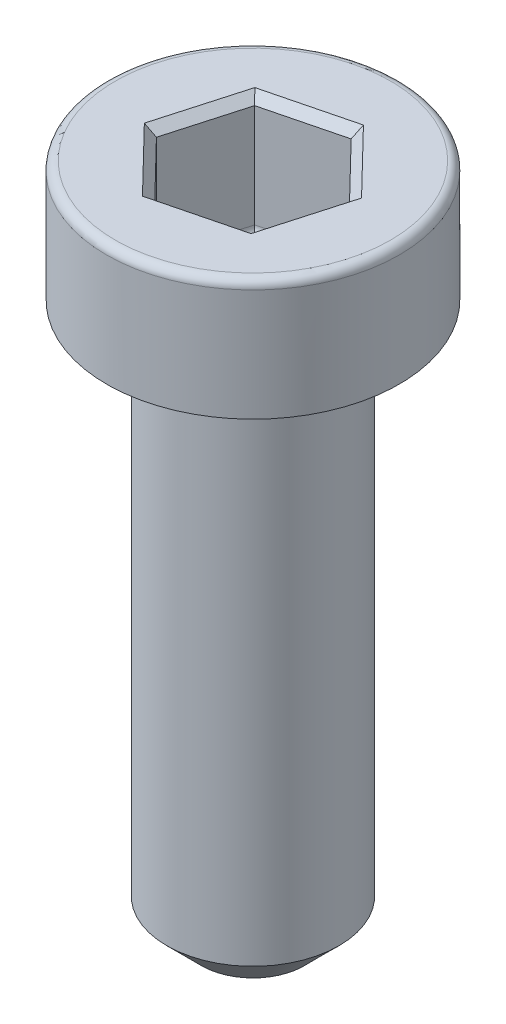
ISO-10303-21;
HEADER;
FILE_DESCRIPTION(('STEP AP214'),'2;1');
FILE_NAME('part.step','',(''),(''),'','','');
FILE_SCHEMA(('AUTOMOTIVE_DESIGN { 1 0 10303 214 1 1 1 1 }'));
ENDSEC;
DATA;
#1=APPLICATION_CONTEXT('core data for automotive mechanical design processes');
#2=APPLICATION_PROTOCOL_DEFINITION('international standard','automotive_design',2000,#1);
#3=PRODUCT_CONTEXT('',#1,'mechanical');
#4=PRODUCT('Part','Part','',(#3));
#5=PRODUCT_RELATED_PRODUCT_CATEGORY('part','',(#4));
#6=PRODUCT_DEFINITION_FORMATION('','',#4);
#7=PRODUCT_DEFINITION_CONTEXT('part definition',#1,'design');
#8=PRODUCT_DEFINITION('design','',#6,#7);
#9=PRODUCT_DEFINITION_SHAPE('','',#8);
#10=(LENGTH_UNIT() NAMED_UNIT(*) SI_UNIT(.MILLI.,.METRE.));
#11=(NAMED_UNIT(*) PLANE_ANGLE_UNIT() SI_UNIT($,.RADIAN.));
#12=(NAMED_UNIT(*) SI_UNIT($,.STERADIAN.) SOLID_ANGLE_UNIT());
#13=UNCERTAINTY_MEASURE_WITH_UNIT(LENGTH_MEASURE(1.E-05),#10,'distance_accuracy_value','');
#14=(GEOMETRIC_REPRESENTATION_CONTEXT(3) GLOBAL_UNCERTAINTY_ASSIGNED_CONTEXT((#13)) GLOBAL_UNIT_ASSIGNED_CONTEXT((#10,
#11,#12)) REPRESENTATION_CONTEXT('',''));
#15=CARTESIAN_POINT('',(0.,0.,0.));
#16=DIRECTION('',(0.,0.,1.));
#17=DIRECTION('',(1.,0.,0.));
#18=AXIS2_PLACEMENT_3D('',#15,#16,#17);
#19=CARTESIAN_POINT('',(-15.1085227313297,17.2,8.58091643659468));
#20=DIRECTION('',(0.,1.,0.));
#21=DIRECTION('',(0.,0.,1.));
#22=AXIS2_PLACEMENT_3D('',#19,#20,#21);
#23=PLANE('',#22);
#24=DIRECTION('',(0.273157966865931,0.,-0.961969191366164));
#25=VECTOR('',#24,1.);
#26=CARTESIAN_POINT('',(-14.8680304334881,17.2,8.64920592831117));
#27=LINE('',#26,#25);
#28=CARTESIAN_POINT('',(-14.9074573899134,17.2,8.78805422120801));
#29=VERTEX_POINT('',#28);
#30=CARTESIAN_POINT('',(-15.4594347798681,17.2,10.7319303217639));
#31=VERTEX_POINT('',#30);
#32=EDGE_CURVE('E156',#29,#31,#27,.F.);
#33=ORIENTED_EDGE('',*,*,#32,.T.);
#34=DIRECTION('',(-0.696510773948106,0.,-0.717546334235086));
#35=VECTOR('',#34,1.);
#36=CARTESIAN_POINT('',(-16.3642288162411,17.2,9.79981029100387));
#37=LINE('',#36,#35);
#38=CARTESIAN_POINT('',(-14.0519773899547,17.2,12.1818948140571));
#39=VERTEX_POINT('',#38);
#40=EDGE_CURVE('E142',#31,#39,#37,.F.);
#41=ORIENTED_EDGE('',*,*,#40,.T.);
#42=DIRECTION('',(-0.969668740814038,0.,0.244422857131077));
#43=VECTOR('',#42,1.);
#44=CARTESIAN_POINT('',(-14.1919370170881,17.2,12.2171742146473));
#45=LINE('',#44,#43);
#46=CARTESIAN_POINT('',(-12.0925426100865,17.2,11.6879832057946));
#47=VERTEX_POINT('',#46);
#48=EDGE_CURVE('E122',#39,#47,#45,.F.);
#49=ORIENTED_EDGE('',*,*,#48,.T.);
#50=DIRECTION('',(-0.273157966865932,0.,0.961969191366164));
#51=VECTOR('',#50,1.);
#52=CARTESIAN_POINT('',(-11.5011382637065,17.2,9.60525881234193));
#53=LINE('',#52,#51);
#54=CARTESIAN_POINT('',(-11.5405652201319,17.2,9.74410710523877));
#55=VERTEX_POINT('',#54);
#56=EDGE_CURVE('E123',#47,#55,#53,.F.);
#57=ORIENTED_EDGE('',*,*,#56,.T.);
#58=DIRECTION('',(0.696510773948106,0.,0.717546334235087));
#59=VECTOR('',#58,1.);
#60=CARTESIAN_POINT('',(-13.8528166464182,17.2,7.36202258218549));
#61=LINE('',#60,#59);
#62=CARTESIAN_POINT('',(-12.9480226100453,17.2,8.29414261294547));
#63=VERTEX_POINT('',#62);
#64=EDGE_CURVE('E161',#55,#63,#61,.F.);
#65=ORIENTED_EDGE('',*,*,#64,.T.);
#66=DIRECTION('',(0.969668740814037,0.,-0.244422857131078));
#67=VECTOR('',#66,1.);
#68=CARTESIAN_POINT('',(-15.0474170170469,17.2,8.82333362179819));
#69=LINE('',#68,#67);
#70=EDGE_CURVE('E160',#63,#29,#69,.F.);
#71=ORIENTED_EDGE('',*,*,#70,.T.);
#72=EDGE_LOOP('',(#33,#41,#49,#57,#65,#71));
#73=FACE_BOUND('',#72,.T.);
#74=ADVANCED_FACE('F16',(#73),#23,.T.);
#75=CARTESIAN_POINT('',(-16.3642288162411,17.45,9.79981029100387));
#76=DIRECTION('',(-0.696510773948106,0.,-0.717546334235086));
#77=DIRECTION('',(-0.717546334235086,0.,0.696510773948106));
#78=AXIS2_PLACEMENT_3D('',#75,#76,#77);
#79=CYLINDRICAL_SURFACE('',#78,0.25);
#80=DIRECTION('',(0.696510773948106,0.,0.717546334235086));
#81=VECTOR('',#80,1.);
#82=CARTESIAN_POINT('',(-15.739354034135,17.45,10.8024891229442));
#83=LINE('',#82,#81);
#84=CARTESIAN_POINT('',(-15.739354034135,17.45,10.8024891229442));
#85=VERTEX_POINT('',#84);
#86=CARTESIAN_POINT('',(-14.1308313028053,17.45,12.4595913998508));
#87=VERTEX_POINT('',#86);
#88=EDGE_CURVE('E103',#85,#87,#83,.T.);
#89=ORIENTED_EDGE('',*,*,#88,.T.);
#90=CARTESIAN_POINT('',(-14.0519773899547,17.45,12.1818948140571));
#91=DIRECTION('',(-0.961969191366164,0.,-0.273157966865931));
#92=DIRECTION('',(-0.273157966865931,0.,0.961969191366164));
#93=AXIS2_PLACEMENT_3D('',#90,#91,#92);
#94=ELLIPSE('',#93,0.288675134594813,0.25);
#95=EDGE_CURVE('E19',#87,#39,#94,.F.);
#96=ORIENTED_EDGE('',*,*,#95,.T.);
#97=ORIENTED_EDGE('',*,*,#40,.F.);
#98=CARTESIAN_POINT('',(-15.4594347798681,17.45,10.7319303217639));
#99=DIRECTION('',(-0.244422857131077,0.,-0.969668740814038));
#100=DIRECTION('',(0.969668740814037,0.,-0.244422857131078));
#101=AXIS2_PLACEMENT_3D('',#98,#99,#100);
#102=ELLIPSE('',#101,0.288675134594813,0.25);
#103=EDGE_CURVE('E109',#31,#85,#102,.T.);
#104=ORIENTED_EDGE('',*,*,#103,.T.);
#105=EDGE_LOOP('',(#89,#96,#97,#104));
#106=FACE_BOUND('',#105,.T.);
#107=ADVANCED_FACE('F105',(#106),#79,.F.);
#108=CARTESIAN_POINT('',(-14.1919370170881,17.45,12.2171742146473));
#109=DIRECTION('',(-0.969668740814038,0.,0.244422857131077));
#110=DIRECTION('',(0.244422857131077,0.,0.969668740814038));
#111=AXIS2_PLACEMENT_3D('',#108,#109,#110);
#112=CYLINDRICAL_SURFACE('',#111,0.25);
#113=DIRECTION('',(0.969668740814037,0.,-0.244422857131077));
#114=VECTOR('',#113,1.);
#115=CARTESIAN_POINT('',(-14.1308313028053,17.45,12.4595913998508));
#116=LINE('',#115,#114);
#117=CARTESIAN_POINT('',(-11.8914772686703,17.45,11.8951209904079));
#118=VERTEX_POINT('',#117);
#119=EDGE_CURVE('E114',#87,#118,#116,.T.);
#120=ORIENTED_EDGE('',*,*,#119,.T.);
#121=CARTESIAN_POINT('',(-12.0925426100865,17.45,11.6879832057946));
#122=DIRECTION('',(-0.717546334235086,0.,0.696510773948106));
#123=DIRECTION('',(0.696510773948106,0.,0.717546334235086));
#124=AXIS2_PLACEMENT_3D('',#121,#122,#123);
#125=ELLIPSE('',#124,0.288675134594813,0.25);
#126=EDGE_CURVE('E164',#118,#47,#125,.F.);
#127=ORIENTED_EDGE('',*,*,#126,.T.);
#128=ORIENTED_EDGE('',*,*,#48,.F.);
#129=ORIENTED_EDGE('',*,*,#95,.F.);
#130=EDGE_LOOP('',(#120,#127,#128,#129));
#131=FACE_BOUND('',#130,.T.);
#132=ADVANCED_FACE('F118',(#131),#112,.F.);
#133=CARTESIAN_POINT('',(-11.5011382637065,17.45,9.60525881234193));
#134=DIRECTION('',(-0.273157966865932,0.,0.961969191366164));
#135=DIRECTION('',(0.961969191366164,0.,0.273157966865932));
#136=AXIS2_PLACEMENT_3D('',#133,#134,#135);
#137=CYLINDRICAL_SURFACE('',#136,0.25);
#138=DIRECTION('',(0.273157966865932,0.,-0.961969191366164));
#139=VECTOR('',#138,1.);
#140=CARTESIAN_POINT('',(-11.8914772686703,17.45,11.8951209904079));
#141=LINE('',#140,#139);
#142=CARTESIAN_POINT('',(-11.260645965865,17.45,9.67354830405841));
#143=VERTEX_POINT('',#142);
#144=EDGE_CURVE('E131',#118,#143,#141,.T.);
#145=ORIENTED_EDGE('',*,*,#144,.T.);
#146=CARTESIAN_POINT('',(-11.5405652201319,17.45,9.74410710523878));
#147=DIRECTION('',(0.244422857131077,0.,0.969668740814037));
#148=DIRECTION('',(0.969668740814038,0.,-0.244422857131077));
#149=AXIS2_PLACEMENT_3D('',#146,#147,#148);
#150=ELLIPSE('',#149,0.288675134594813,0.25);
#151=EDGE_CURVE('E162',#143,#55,#150,.F.);
#152=ORIENTED_EDGE('',*,*,#151,.T.);
#153=ORIENTED_EDGE('',*,*,#56,.F.);
#154=ORIENTED_EDGE('',*,*,#126,.F.);
#155=EDGE_LOOP('',(#145,#152,#153,#154));
#156=FACE_BOUND('',#155,.T.);
#157=ADVANCED_FACE('F313',(#156),#137,.F.);
#158=CARTESIAN_POINT('',(-13.8528166464182,17.45,7.3620225821855));
#159=DIRECTION('',(0.696510773948106,0.,0.717546334235087));
#160=DIRECTION('',(0.717546334235087,0.,-0.696510773948106));
#161=AXIS2_PLACEMENT_3D('',#158,#159,#160);
#162=CYLINDRICAL_SURFACE('',#161,0.25);
#163=ORIENTED_EDGE('',*,*,#64,.F.);
#164=ORIENTED_EDGE('',*,*,#151,.F.);
#165=DIRECTION('',(-0.696510773948106,0.,-0.717546334235087));
#166=VECTOR('',#165,1.);
#167=CARTESIAN_POINT('',(-11.260645965865,17.45,9.67354830405841));
#168=LINE('',#167,#166);
#169=CARTESIAN_POINT('',(-12.8691686971946,17.45,8.01644602715178));
#170=VERTEX_POINT('',#169);
#171=EDGE_CURVE('E173',#143,#170,#168,.T.);
#172=ORIENTED_EDGE('',*,*,#171,.T.);
#173=CARTESIAN_POINT('',(-12.9480226100453,17.45,8.29414261294547));
#174=DIRECTION('',(0.961969191366164,0.,0.273157966865931));
#175=DIRECTION('',(0.273157966865932,0.,-0.961969191366164));
#176=AXIS2_PLACEMENT_3D('',#173,#174,#175);
#177=ELLIPSE('',#176,0.288675134594813,0.25);
#178=EDGE_CURVE('E157',#170,#63,#177,.F.);
#179=ORIENTED_EDGE('',*,*,#178,.T.);
#180=EDGE_LOOP('',(#163,#164,#172,#179));
#181=FACE_BOUND('',#180,.T.);
#182=ADVANCED_FACE('F309',(#181),#162,.F.);
#183=CARTESIAN_POINT('',(-15.0474170170469,17.45,8.82333362179819));
#184=DIRECTION('',(0.969668740814037,0.,-0.244422857131078));
#185=DIRECTION('',(-0.244422857131078,0.,-0.969668740814037));
#186=AXIS2_PLACEMENT_3D('',#183,#184,#185);
#187=CYLINDRICAL_SURFACE('',#186,0.25);
#188=ORIENTED_EDGE('',*,*,#70,.F.);
#189=ORIENTED_EDGE('',*,*,#178,.F.);
#190=DIRECTION('',(-0.969668740814038,0.,0.244422857131077));
#191=VECTOR('',#190,1.);
#192=CARTESIAN_POINT('',(-12.8691686971946,17.45,8.01644602715178));
#193=LINE('',#192,#191);
#194=CARTESIAN_POINT('',(-15.1085227313296,17.45,8.58091643659468));
#195=VERTEX_POINT('',#194);
#196=EDGE_CURVE('E172',#170,#195,#193,.T.);
#197=ORIENTED_EDGE('',*,*,#196,.T.);
#198=CARTESIAN_POINT('',(-14.9074573899134,17.45,8.78805422120801));
#199=DIRECTION('',(0.717546334235086,0.,-0.696510773948106));
#200=DIRECTION('',(-0.696510773948106,0.,-0.717546334235086));
#201=AXIS2_PLACEMENT_3D('',#198,#199,#200);
#202=ELLIPSE('',#201,0.288675134594813,0.25);
#203=EDGE_CURVE('E115',#195,#29,#202,.F.);
#204=ORIENTED_EDGE('',*,*,#203,.T.);
#205=EDGE_LOOP('',(#188,#189,#197,#204));
#206=FACE_BOUND('',#205,.T.);
#207=ADVANCED_FACE('F302',(#206),#187,.F.);
#208=CARTESIAN_POINT('',(-14.8680304334881,17.45,8.64920592831117));
#209=DIRECTION('',(0.273157966865931,0.,-0.961969191366164));
#210=DIRECTION('',(-0.961969191366164,0.,-0.273157966865931));
#211=AXIS2_PLACEMENT_3D('',#208,#209,#210);
#212=CYLINDRICAL_SURFACE('',#211,0.25);
#213=DIRECTION('',(-0.273157966865931,0.,0.961969191366164));
#214=VECTOR('',#213,1.);
#215=CARTESIAN_POINT('',(-15.1085227313297,17.45,8.58091643659468));
#216=LINE('',#215,#214);
#217=EDGE_CURVE('E179',#195,#85,#216,.T.);
#218=ORIENTED_EDGE('',*,*,#217,.T.);
#219=ORIENTED_EDGE('',*,*,#103,.F.);
#220=ORIENTED_EDGE('',*,*,#32,.F.);
#221=ORIENTED_EDGE('',*,*,#203,.F.);
#222=EDGE_LOOP('',(#218,#219,#220,#221));
#223=FACE_BOUND('',#222,.T.);
#224=ADVANCED_FACE('F305',(#223),#212,.F.);
#225=CARTESIAN_POINT('',(-15.739354034135,17.2,10.8024891229442));
#226=DIRECTION('',(-0.717546334235086,0.,0.696510773948106));
#227=DIRECTION('',(0.696510773948106,0.,0.717546334235086));
#228=AXIS2_PLACEMENT_3D('',#225,#226,#227);
#229=PLANE('',#228);
#230=DIRECTION('',(0.696510773948105,0.,0.717546334235087));
#231=VECTOR('',#230,1.);
#232=CARTESIAN_POINT('',(-15.739354034135,20.45,10.8024891229442));
#233=LINE('',#232,#231);
#234=CARTESIAN_POINT('',(-15.739354034135,20.45,10.8024891229442));
#235=VERTEX_POINT('',#234);
#236=CARTESIAN_POINT('',(-14.1308313028053,20.45,12.4595913998508));
#237=VERTEX_POINT('',#236);
#238=EDGE_CURVE('E128',#235,#237,#233,.T.);
#239=ORIENTED_EDGE('',*,*,#238,.T.);
#240=DIRECTION('',(0.,1.,0.));
#241=VECTOR('',#240,1.);
#242=CARTESIAN_POINT('',(-14.1308313028053,17.2,12.4595913998508));
#243=LINE('',#242,#241);
#244=EDGE_CURVE('E125',#237,#87,#243,.F.);
#245=ORIENTED_EDGE('',*,*,#244,.T.);
#246=ORIENTED_EDGE('',*,*,#88,.F.);
#247=DIRECTION('',(0.,1.,0.));
#248=VECTOR('',#247,1.);
#249=CARTESIAN_POINT('',(-15.739354034135,17.2,10.8024891229442));
#250=LINE('',#249,#248);
#251=EDGE_CURVE('E181',#85,#235,#250,.T.);
#252=ORIENTED_EDGE('',*,*,#251,.T.);
#253=EDGE_LOOP('',(#239,#245,#246,#252));
#254=FACE_BOUND('',#253,.T.);
#255=ADVANCED_FACE('F126',(#254),#229,.F.);
#256=CARTESIAN_POINT('',(-14.1308313028053,17.2,12.4595913998508));
#257=DIRECTION('',(0.244422857131077,0.,0.969668740814037));
#258=DIRECTION('',(0.969668740814037,0.,-0.244422857131077));
#259=AXIS2_PLACEMENT_3D('',#256,#257,#258);
#260=PLANE('',#259);
#261=DIRECTION('',(0.969668740814037,0.,-0.244422857131079));
#262=VECTOR('',#261,1.);
#263=CARTESIAN_POINT('',(-14.1308313028053,20.45,12.4595913998508));
#264=LINE('',#263,#262);
#265=CARTESIAN_POINT('',(-11.8914772686703,20.45,11.8951209904079));
#266=VERTEX_POINT('',#265);
#267=EDGE_CURVE('E190',#237,#266,#264,.T.);
#268=ORIENTED_EDGE('',*,*,#267,.T.);
#269=DIRECTION('',(0.,1.,0.));
#270=VECTOR('',#269,1.);
#271=CARTESIAN_POINT('',(-11.8914772686703,17.2,11.8951209904079));
#272=LINE('',#271,#270);
#273=EDGE_CURVE('E136',#266,#118,#272,.F.);
#274=ORIENTED_EDGE('',*,*,#273,.T.);
#275=ORIENTED_EDGE('',*,*,#119,.F.);
#276=ORIENTED_EDGE('',*,*,#244,.F.);
#277=EDGE_LOOP('',(#268,#274,#275,#276));
#278=FACE_BOUND('',#277,.T.);
#279=ADVANCED_FACE('F134',(#278),#260,.F.);
#280=CARTESIAN_POINT('',(-11.8914772686703,17.2,11.8951209904079));
#281=DIRECTION('',(0.961969191366164,0.,0.273157966865932));
#282=DIRECTION('',(0.273157966865932,0.,-0.961969191366164));
#283=AXIS2_PLACEMENT_3D('',#280,#281,#282);
#284=PLANE('',#283);
#285=DIRECTION('',(0.273157966865931,0.,-0.961969191366164));
#286=VECTOR('',#285,1.);
#287=CARTESIAN_POINT('',(-11.8914772686703,20.45,11.8951209904079));
#288=LINE('',#287,#286);
#289=CARTESIAN_POINT('',(-11.260645965865,20.45,9.67354830405841));
#290=VERTEX_POINT('',#289);
#291=EDGE_CURVE('E194',#266,#290,#288,.T.);
#292=ORIENTED_EDGE('',*,*,#291,.T.);
#293=DIRECTION('',(0.,1.,0.));
#294=VECTOR('',#293,1.);
#295=CARTESIAN_POINT('',(-11.260645965865,17.2,9.67354830405841));
#296=LINE('',#295,#294);
#297=EDGE_CURVE('E169',#290,#143,#296,.F.);
#298=ORIENTED_EDGE('',*,*,#297,.T.);
#299=ORIENTED_EDGE('',*,*,#144,.F.);
#300=ORIENTED_EDGE('',*,*,#273,.F.);
#301=EDGE_LOOP('',(#292,#298,#299,#300));
#302=FACE_BOUND('',#301,.T.);
#303=ADVANCED_FACE('F312',(#302),#284,.F.);
#304=CARTESIAN_POINT('',(-11.260645965865,17.2,9.67354830405841));
#305=DIRECTION('',(0.717546334235087,0.,-0.696510773948106));
#306=DIRECTION('',(-0.696510773948106,0.,-0.717546334235087));
#307=AXIS2_PLACEMENT_3D('',#304,#305,#306);
#308=PLANE('',#307);
#309=DIRECTION('',(-0.696510773948106,0.,-0.717546334235086));
#310=VECTOR('',#309,1.);
#311=CARTESIAN_POINT('',(-11.260645965865,20.45,9.67354830405841));
#312=LINE('',#311,#310);
#313=CARTESIAN_POINT('',(-12.8691686971946,20.45,8.01644602715178));
#314=VERTEX_POINT('',#313);
#315=EDGE_CURVE('E199',#290,#314,#312,.T.);
#316=ORIENTED_EDGE('',*,*,#315,.T.);
#317=DIRECTION('',(0.,1.,0.));
#318=VECTOR('',#317,1.);
#319=CARTESIAN_POINT('',(-12.8691686971946,17.2,8.01644602715178));
#320=LINE('',#319,#318);
#321=EDGE_CURVE('E176',#314,#170,#320,.F.);
#322=ORIENTED_EDGE('',*,*,#321,.T.);
#323=ORIENTED_EDGE('',*,*,#171,.F.);
#324=ORIENTED_EDGE('',*,*,#297,.F.);
#325=EDGE_LOOP('',(#316,#322,#323,#324));
#326=FACE_BOUND('',#325,.T.);
#327=ADVANCED_FACE('F291',(#326),#308,.F.);
#328=CARTESIAN_POINT('',(-12.8691686971946,17.2,8.01644602715178));
#329=DIRECTION('',(-0.244422857131077,0.,-0.969668740814038));
#330=DIRECTION('',(-0.969668740814038,0.,0.244422857131077));
#331=AXIS2_PLACEMENT_3D('',#328,#329,#330);
#332=PLANE('',#331);
#333=DIRECTION('',(-0.969668740814037,0.,0.244422857131078));
#334=VECTOR('',#333,1.);
#335=CARTESIAN_POINT('',(-12.8691686971946,20.45,8.01644602715178));
#336=LINE('',#335,#334);
#337=CARTESIAN_POINT('',(-15.1085227313297,20.45,8.58091643659468));
#338=VERTEX_POINT('',#337);
#339=EDGE_CURVE('E204',#314,#338,#336,.T.);
#340=ORIENTED_EDGE('',*,*,#339,.T.);
#341=DIRECTION('',(0.,1.,0.));
#342=VECTOR('',#341,1.);
#343=CARTESIAN_POINT('',(-15.1085227313297,17.2,8.58091643659468));
#344=LINE('',#343,#342);
#345=EDGE_CURVE('E182',#338,#195,#344,.F.);
#346=ORIENTED_EDGE('',*,*,#345,.T.);
#347=ORIENTED_EDGE('',*,*,#196,.F.);
#348=ORIENTED_EDGE('',*,*,#321,.F.);
#349=EDGE_LOOP('',(#340,#346,#347,#348));
#350=FACE_BOUND('',#349,.T.);
#351=ADVANCED_FACE('F295',(#350),#332,.F.);
#352=CARTESIAN_POINT('',(-15.1085227313297,17.2,8.58091643659468));
#353=DIRECTION('',(-0.961969191366164,0.,-0.273157966865931));
#354=DIRECTION('',(-0.273157966865931,0.,0.961969191366164));
#355=AXIS2_PLACEMENT_3D('',#352,#353,#354);
#356=PLANE('',#355);
#357=DIRECTION('',(-0.273157966865931,0.,0.961969191366164));
#358=VECTOR('',#357,1.);
#359=CARTESIAN_POINT('',(-15.1085227313297,20.45,8.58091643659468));
#360=LINE('',#359,#358);
#361=EDGE_CURVE('E211',#338,#235,#360,.T.);
#362=ORIENTED_EDGE('',*,*,#361,.T.);
#363=ORIENTED_EDGE('',*,*,#251,.F.);
#364=ORIENTED_EDGE('',*,*,#217,.F.);
#365=ORIENTED_EDGE('',*,*,#345,.F.);
#366=EDGE_LOOP('',(#362,#363,#364,#365));
#367=FACE_BOUND('',#366,.T.);
#368=ADVANCED_FACE('F405',(#367),#356,.F.);
#369=CARTESIAN_POINT('',(-15.739354034135,20.45,10.8024891229442));
#370=DIRECTION('',(-0.507381878753175,-0.707106781186552,0.492507491428194));
#371=DIRECTION('',(0.81247858804396,-0.582991032495435,0.));
#372=AXIS2_PLACEMENT_3D('',#369,#370,#371);
#373=PLANE('',#372);
#374=ORIENTED_EDGE('',*,*,#238,.F.);
#375=DIRECTION('',(-0.733000669230603,0.654653670707968,0.184766312773925));
#376=VECTOR('',#375,1.);
#377=CARTESIAN_POINT('',(-15.739354034135,20.45,10.8024891229442));
#378=LINE('',#377,#376);
#379=CARTESIAN_POINT('',(-16.0192732884019,20.7,10.8730479241246));
#380=VERTEX_POINT('',#379);
#381=EDGE_CURVE('E214',#235,#380,#378,.T.);
#382=ORIENTED_EDGE('',*,*,#381,.T.);
#383=DIRECTION('',(0.696510773948107,0.,0.717546334235085));
#384=VECTOR('',#383,1.);
#385=CARTESIAN_POINT('',(-16.0192732884019,20.7,10.8730479241246));
#386=LINE('',#385,#384);
#387=CARTESIAN_POINT('',(-14.209685215656,20.7,12.7372879856445));
#388=VERTEX_POINT('',#387);
#389=EDGE_CURVE('E216',#380,#388,#386,.T.);
#390=ORIENTED_EDGE('',*,*,#389,.T.);
#391=DIRECTION('',(0.206488013989507,-0.654653670707973,-0.727180356931653));
#392=VECTOR('',#391,1.);
#393=CARTESIAN_POINT('',(-14.209685215656,20.7,12.7372879856445));
#394=LINE('',#393,#392);
#395=EDGE_CURVE('E192',#388,#237,#394,.T.);
#396=ORIENTED_EDGE('',*,*,#395,.T.);
#397=EDGE_LOOP('',(#374,#382,#390,#396));
#398=FACE_BOUND('',#397,.T.);
#399=ADVANCED_FACE('F269',(#398),#373,.F.);
#400=CARTESIAN_POINT('',(-14.1308313028053,20.45,12.4595913998508));
#401=DIRECTION('',(0.172833059754375,-0.707106781186552,0.685659342134223));
#402=DIRECTION('',(0.,-0.696135391386089,-0.717910521485607));
#403=AXIS2_PLACEMENT_3D('',#400,#401,#402);
#404=PLANE('',#403);
#405=DIRECTION('',(0.969668740814038,0.,-0.244422857131076));
#406=VECTOR('',#405,1.);
#407=CARTESIAN_POINT('',(-14.209685215656,20.7,12.7372879856445));
#408=LINE('',#407,#406);
#409=CARTESIAN_POINT('',(-11.6904119272541,20.7,12.1022587750213));
#410=VERTEX_POINT('',#409);
#411=EDGE_CURVE('E265',#388,#410,#408,.T.);
#412=ORIENTED_EDGE('',*,*,#411,.T.);
#413=DIRECTION('',(-0.526512655241091,-0.654653670707973,-0.542414044157738));
#414=VECTOR('',#413,1.);
#415=CARTESIAN_POINT('',(-11.6904119272541,20.7,12.1022587750213));
#416=LINE('',#415,#414);
#417=EDGE_CURVE('E196',#410,#266,#416,.T.);
#418=ORIENTED_EDGE('',*,*,#417,.T.);
#419=ORIENTED_EDGE('',*,*,#267,.F.);
#420=ORIENTED_EDGE('',*,*,#395,.F.);
#421=EDGE_LOOP('',(#412,#418,#419,#420));
#422=FACE_BOUND('',#421,.T.);
#423=ADVANCED_FACE('F276',(#422),#404,.F.);
#424=CARTESIAN_POINT('',(-11.8914772686703,20.45,11.8951209904079));
#425=DIRECTION('',(0.680214938507551,-0.707106781186551,0.19315185070603));
#426=DIRECTION('',(0.720677957409823,0.693269991924939,0.));
#427=AXIS2_PLACEMENT_3D('',#424,#425,#426);
#428=PLANE('',#427);
#429=DIRECTION('',(0.27315796686593,0.,-0.961969191366164));
#430=VECTOR('',#429,1.);
#431=CARTESIAN_POINT('',(-11.6904119272541,20.7,12.1022587750213));
#432=LINE('',#431,#430);
#433=CARTESIAN_POINT('',(-10.9807267115981,20.7,9.60298950287804));
#434=VERTEX_POINT('',#433);
#435=EDGE_CURVE('E263',#410,#434,#432,.T.);
#436=ORIENTED_EDGE('',*,*,#435,.T.);
#437=DIRECTION('',(-0.733000669230601,-0.654653670707974,0.184766312773913));
#438=VECTOR('',#437,1.);
#439=CARTESIAN_POINT('',(-10.9807267115981,20.7,9.60298950287805));
#440=LINE('',#439,#438);
#441=EDGE_CURVE('E201',#434,#290,#440,.T.);
#442=ORIENTED_EDGE('',*,*,#441,.T.);
#443=ORIENTED_EDGE('',*,*,#291,.F.);
#444=ORIENTED_EDGE('',*,*,#417,.F.);
#445=EDGE_LOOP('',(#436,#442,#443,#444));
#446=FACE_BOUND('',#445,.T.);
#447=ADVANCED_FACE('F282',(#446),#428,.F.);
#448=CARTESIAN_POINT('',(-11.260645965865,20.45,9.67354830405841));
#449=DIRECTION('',(0.507381878753176,-0.707106781186551,-0.492507491428194));
#450=DIRECTION('',(0.81247858804396,0.582991032495435,0.));
#451=AXIS2_PLACEMENT_3D('',#448,#449,#450);
#452=PLANE('',#451);
#453=DIRECTION('',(-0.696510773948106,0.,-0.717546334235087));
#454=VECTOR('',#453,1.);
#455=CARTESIAN_POINT('',(-10.9807267115981,20.7,9.60298950287805));
#456=LINE('',#455,#454);
#457=CARTESIAN_POINT('',(-12.790314784344,20.7,7.73874944135808));
#458=VERTEX_POINT('',#457);
#459=EDGE_CURVE('E261',#434,#458,#456,.T.);
#460=ORIENTED_EDGE('',*,*,#459,.T.);
#461=DIRECTION('',(-0.2064880139895,-0.654653670707976,0.727180356931652));
#462=VECTOR('',#461,1.);
#463=CARTESIAN_POINT('',(-12.790314784344,20.7,7.73874944135808));
#464=LINE('',#463,#462);
#465=EDGE_CURVE('E206',#458,#314,#464,.T.);
#466=ORIENTED_EDGE('',*,*,#465,.T.);
#467=ORIENTED_EDGE('',*,*,#315,.F.);
#468=ORIENTED_EDGE('',*,*,#441,.F.);
#469=EDGE_LOOP('',(#460,#466,#467,#468));
#470=FACE_BOUND('',#469,.T.);
#471=ADVANCED_FACE('F286',(#470),#452,.F.);
#472=CARTESIAN_POINT('',(-12.8691686971946,20.45,8.01644602715178));
#473=DIRECTION('',(-0.172833059754375,-0.707106781186551,-0.685659342134223));
#474=DIRECTION('',(0.,0.69613539138609,-0.717910521485607));
#475=AXIS2_PLACEMENT_3D('',#472,#473,#474);
#476=PLANE('',#475);
#477=DIRECTION('',(-0.969668740814037,0.,0.244422857131079));
#478=VECTOR('',#477,1.);
#479=CARTESIAN_POINT('',(-12.790314784344,20.7,7.73874944135808));
#480=LINE('',#479,#478);
#481=CARTESIAN_POINT('',(-15.3095880727459,20.7,8.37377865198135));
#482=VERTEX_POINT('',#481);
#483=EDGE_CURVE('E34',#458,#482,#480,.T.);
#484=ORIENTED_EDGE('',*,*,#483,.T.);
#485=DIRECTION('',(0.526512655241088,-0.654653670707975,0.54241404415774));
#486=VECTOR('',#485,1.);
#487=CARTESIAN_POINT('',(-15.3095880727459,20.7,8.37377865198135));
#488=LINE('',#487,#486);
#489=EDGE_CURVE('E209',#482,#338,#488,.T.);
#490=ORIENTED_EDGE('',*,*,#489,.T.);
#491=ORIENTED_EDGE('',*,*,#339,.F.);
#492=ORIENTED_EDGE('',*,*,#465,.F.);
#493=EDGE_LOOP('',(#484,#490,#491,#492));
#494=FACE_BOUND('',#493,.T.);
#495=ADVANCED_FACE('F374',(#494),#476,.F.);
#496=CARTESIAN_POINT('',(-15.1085227313297,20.45,8.58091643659468));
#497=DIRECTION('',(-0.680214938507551,-0.707106781186551,-0.19315185070603));
#498=DIRECTION('',(0.720677957409823,-0.69326999192494,0.));
#499=AXIS2_PLACEMENT_3D('',#496,#497,#498);
#500=PLANE('',#499);
#501=ORIENTED_EDGE('',*,*,#361,.F.);
#502=ORIENTED_EDGE('',*,*,#489,.F.);
#503=DIRECTION('',(-0.273157966865933,0.,0.961969191366163));
#504=VECTOR('',#503,1.);
#505=CARTESIAN_POINT('',(-15.3095880727459,20.7,8.37377865198135));
#506=LINE('',#505,#504);
#507=EDGE_CURVE('E252',#482,#380,#506,.T.);
#508=ORIENTED_EDGE('',*,*,#507,.T.);
#509=ORIENTED_EDGE('',*,*,#381,.F.);
#510=EDGE_LOOP('',(#501,#502,#508,#509));
#511=FACE_BOUND('',#510,.T.);
#512=ADVANCED_FACE('F368',(#511),#500,.F.);
#513=CARTESIAN_POINT('',(-13.5,20.7,10.2380187135013));
#514=DIRECTION('',(0.,-1.,0.));
#515=DIRECTION('',(1.,0.,0.));
#516=AXIS2_PLACEMENT_3D('',#513,#514,#515);
#517=PLANE('',#516);
#518=ORIENTED_EDGE('',*,*,#483,.F.);
#519=ORIENTED_EDGE('',*,*,#459,.F.);
#520=ORIENTED_EDGE('',*,*,#435,.F.);
#521=ORIENTED_EDGE('',*,*,#411,.F.);
#522=ORIENTED_EDGE('',*,*,#389,.F.);
#523=ORIENTED_EDGE('',*,*,#507,.F.);
#524=EDGE_LOOP('',(#518,#519,#520,#521,#522,#523));
#525=FACE_BOUND('',#524,.T.);
#526=CARTESIAN_POINT('',(-13.5,20.7,10.2380187135013));
#527=DIRECTION('',(0.,-1.,0.));
#528=DIRECTION('',(1.,0.,0.));
#529=AXIS2_PLACEMENT_3D('',#526,#527,#528);
#530=CIRCLE('',#529,4.00000000000001);
#531=CARTESIAN_POINT('',(-9.49999999999999,20.7,10.2380187135013));
#532=VERTEX_POINT('',#531);
#533=EDGE_CURVE('E245',#532,#532,#530,.T.);
#534=ORIENTED_EDGE('',*,*,#533,.F.);
#535=EDGE_LOOP('',(#534));
#536=FACE_BOUND('',#535,.T.);
#537=ADVANCED_FACE('F235',(#525,#536),#517,.F.);
#538=CARTESIAN_POINT('',(-13.5,20.45,10.2380187135013));
#539=DIRECTION('',(0.,-1.,0.));
#540=DIRECTION('',(1.,0.,0.));
#541=AXIS2_PLACEMENT_3D('',#538,#539,#540);
#542=TOROIDAL_SURFACE('',#541,4.,0.25);
#543=CARTESIAN_POINT('',(-13.5,20.45,10.2380187135013));
#544=DIRECTION('',(0.,1.,0.));
#545=DIRECTION('',(-1.,0.,0.));
#546=AXIS2_PLACEMENT_3D('',#543,#544,#545);
#547=CIRCLE('',#546,4.25000000000001);
#548=CARTESIAN_POINT('',(-17.75,20.45,10.2380187135013));
#549=VERTEX_POINT('',#548);
#550=EDGE_CURVE('E152',#549,#549,#547,.F.);
#551=ORIENTED_EDGE('',*,*,#550,.F.);
#552=EDGE_LOOP('',(#551));
#553=FACE_BOUND('',#552,.T.);
#554=ORIENTED_EDGE('',*,*,#533,.T.);
#555=EDGE_LOOP('',(#554));
#556=FACE_BOUND('',#555,.T.);
#557=ADVANCED_FACE('F223',(#553,#556),#542,.T.);
#558=CARTESIAN_POINT('',(-13.5,1.2,10.2380187135013));
#559=DIRECTION('',(0.,-1.,0.));
#560=DIRECTION('',(1.,0.,0.));
#561=AXIS2_PLACEMENT_3D('',#558,#559,#560);
#562=PLANE('',#561);
#563=CARTESIAN_POINT('',(-13.5,1.20000000003984,10.2380187135013));
#564=DIRECTION('',(0.,1.,0.));
#565=DIRECTION('',(-1.,0.,0.));
#566=AXIS2_PLACEMENT_3D('',#563,#564,#565);
#567=CIRCLE('',#566,1.5000000000432);
#568=CARTESIAN_POINT('',(-15.0000000000432,1.20000000003984,10.2380187135013));
#569=VERTEX_POINT('',#568);
#570=EDGE_CURVE('E149',#569,#569,#567,.T.);
#571=ORIENTED_EDGE('',*,*,#570,.F.);
#572=EDGE_LOOP('',(#571));
#573=FACE_BOUND('',#572,.T.);
#574=ADVANCED_FACE('F234',(#573),#562,.T.);
#575=CARTESIAN_POINT('',(-13.5,20.7,10.2380187135013));
#576=DIRECTION('',(0.,1.,0.));
#577=DIRECTION('',(-1.,0.,0.));
#578=AXIS2_PLACEMENT_3D('',#575,#576,#577);
#579=CYLINDRICAL_SURFACE('',#578,4.25000000000001);
#580=CARTESIAN_POINT('',(-13.5,17.2,10.2380187135013));
#581=DIRECTION('',(0.,1.,0.));
#582=DIRECTION('',(-1.,0.,0.));
#583=AXIS2_PLACEMENT_3D('',#580,#581,#582);
#584=CIRCLE('',#583,4.25000000000001);
#585=CARTESIAN_POINT('',(-17.75,17.2,10.2380187135013));
#586=VERTEX_POINT('',#585);
#587=EDGE_CURVE('E146',#586,#586,#584,.F.);
#588=ORIENTED_EDGE('',*,*,#587,.F.);
#589=EDGE_LOOP('',(#588));
#590=FACE_BOUND('',#589,.T.);
#591=ORIENTED_EDGE('',*,*,#550,.T.);
#592=EDGE_LOOP('',(#591));
#593=FACE_BOUND('',#592,.T.);
#594=ADVANCED_FACE('F338',(#590,#593),#579,.T.);
#595=CARTESIAN_POINT('',(-13.5,2.20000000012988,10.2380187135013));
#596=DIRECTION('',(0.,1.,0.));
#597=DIRECTION('',(-1.,0.,0.));
#598=AXIS2_PLACEMENT_3D('',#595,#596,#597);
#599=CONICAL_SURFACE('',#598,2.50000000013324,0.785398163397448);
#600=ORIENTED_EDGE('',*,*,#570,.T.);
#601=EDGE_LOOP('',(#600));
#602=FACE_BOUND('',#601,.T.);
#603=CARTESIAN_POINT('',(-13.5,2.20000000000001,10.2380187135013));
#604=DIRECTION('',(0.,-1.,0.));
#605=DIRECTION('',(1.,0.,0.));
#606=AXIS2_PLACEMENT_3D('',#603,#604,#605);
#607=CIRCLE('',#606,2.5);
#608=CARTESIAN_POINT('',(-11.,2.20000000000001,10.2380187135013));
#609=VERTEX_POINT('',#608);
#610=EDGE_CURVE('E25',#609,#609,#607,.F.);
#611=ORIENTED_EDGE('',*,*,#610,.F.);
#612=EDGE_LOOP('',(#611));
#613=FACE_BOUND('',#612,.T.);
#614=ADVANCED_FACE('F331',(#602,#613),#599,.T.);
#615=CARTESIAN_POINT('',(-13.5,17.2,10.2380187135013));
#616=DIRECTION('',(0.,-1.,0.));
#617=DIRECTION('',(1.,0.,0.));
#618=AXIS2_PLACEMENT_3D('',#615,#616,#617);
#619=PLANE('',#618);
#620=CARTESIAN_POINT('',(-13.5,17.2,10.2380187135013));
#621=DIRECTION('',(0.,-1.,0.));
#622=DIRECTION('',(1.,0.,0.));
#623=AXIS2_PLACEMENT_3D('',#620,#621,#622);
#624=CIRCLE('',#623,2.5);
#625=CARTESIAN_POINT('',(-11.,17.2,10.2380187135013));
#626=VERTEX_POINT('',#625);
#627=EDGE_CURVE('E11',#626,#626,#624,.T.);
#628=ORIENTED_EDGE('',*,*,#627,.F.);
#629=EDGE_LOOP('',(#628));
#630=FACE_BOUND('',#629,.T.);
#631=ORIENTED_EDGE('',*,*,#587,.T.);
#632=EDGE_LOOP('',(#631));
#633=FACE_BOUND('',#632,.T.);
#634=ADVANCED_FACE('F325',(#630,#633),#619,.T.);
#635=CARTESIAN_POINT('',(-13.5,1.2,10.2380187135013));
#636=DIRECTION('',(0.,-1.,0.));
#637=DIRECTION('',(1.,0.,0.));
#638=AXIS2_PLACEMENT_3D('',#635,#636,#637);
#639=CYLINDRICAL_SURFACE('',#638,2.5);
#640=ORIENTED_EDGE('',*,*,#610,.T.);
#641=EDGE_LOOP('',(#640));
#642=FACE_BOUND('',#641,.T.);
#643=ORIENTED_EDGE('',*,*,#627,.T.);
#644=EDGE_LOOP('',(#643));
#645=FACE_BOUND('',#644,.T.);
#646=ADVANCED_FACE('F323',(#642,#645),#639,.T.);
#647=CLOSED_SHELL('',(#74,#107,#132,#157,#182,#207,#224,#255,#279,#303,#327,#351,#368,#399,#423,
#447,#471,#495,#512,#537,#557,#574,#594,#614,#634,#646));
#648=MANIFOLD_SOLID_BREP('B1',#647);
#649=ADVANCED_BREP_SHAPE_REPRESENTATION('',(#18,#648),#14);
#650=SHAPE_DEFINITION_REPRESENTATION(#9,#649);
ENDSEC;
END-ISO-10303-21;
